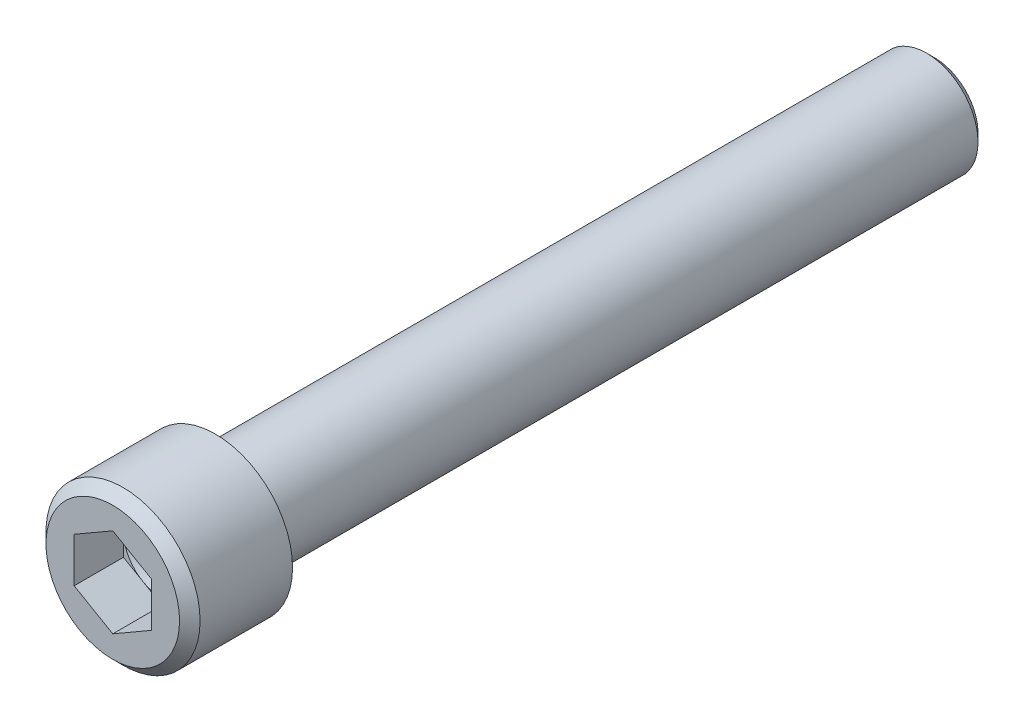
ISO-10303-21;
HEADER;
FILE_DESCRIPTION(('STEP AP214'),'2;1');
FILE_NAME('part.step','',(''),(''),'','','');
FILE_SCHEMA(('AUTOMOTIVE_DESIGN { 1 0 10303 214 1 1 1 1 }'));
ENDSEC;
DATA;
#1=APPLICATION_CONTEXT('core data for automotive mechanical design processes');
#2=APPLICATION_PROTOCOL_DEFINITION('international standard','automotive_design',2000,#1);
#3=PRODUCT_CONTEXT('',#1,'mechanical');
#4=PRODUCT('Part','Part','',(#3));
#5=PRODUCT_RELATED_PRODUCT_CATEGORY('part','',(#4));
#6=PRODUCT_DEFINITION_FORMATION('','',#4);
#7=PRODUCT_DEFINITION_CONTEXT('part definition',#1,'design');
#8=PRODUCT_DEFINITION('design','',#6,#7);
#9=PRODUCT_DEFINITION_SHAPE('','',#8);
#10=(LENGTH_UNIT() NAMED_UNIT(*) SI_UNIT(.MILLI.,.METRE.));
#11=(NAMED_UNIT(*) PLANE_ANGLE_UNIT() SI_UNIT($,.RADIAN.));
#12=(NAMED_UNIT(*) SI_UNIT($,.STERADIAN.) SOLID_ANGLE_UNIT());
#13=UNCERTAINTY_MEASURE_WITH_UNIT(LENGTH_MEASURE(1.E-05),#10,'distance_accuracy_value','');
#14=(GEOMETRIC_REPRESENTATION_CONTEXT(3) GLOBAL_UNCERTAINTY_ASSIGNED_CONTEXT((#13)) GLOBAL_UNIT_ASSIGNED_CONTEXT((#10,
#11,#12)) REPRESENTATION_CONTEXT('',''));
#15=CARTESIAN_POINT('',(0.,0.,0.));
#16=DIRECTION('',(0.,0.,1.));
#17=DIRECTION('',(1.,0.,0.));
#18=AXIS2_PLACEMENT_3D('',#15,#16,#17);
#19=CARTESIAN_POINT('',(0.,0.,3.302));
#20=DIRECTION('',(0.,0.,1.));
#21=DIRECTION('',(1.,0.,0.));
#22=AXIS2_PLACEMENT_3D('',#19,#20,#21);
#23=PLANE('',#22);
#24=DIRECTION('',(0.,1.,0.));
#25=VECTOR('',#24,1.);
#26=CARTESIAN_POINT('',(-2.3876,0.,3.302));
#27=LINE('',#26,#25);
#28=CARTESIAN_POINT('',(-2.3876,0.,3.302));
#29=VERTEX_POINT('',#28);
#30=CARTESIAN_POINT('',(-2.3876,1.37848150271715,3.302));
#31=VERTEX_POINT('',#30);
#32=EDGE_CURVE('E396',#29,#31,#27,.T.);
#33=ORIENTED_EDGE('',*,*,#32,.F.);
#34=CARTESIAN_POINT('',(0.,0.,3.302));
#35=DIRECTION('',(0.,0.,-1.));
#36=DIRECTION('',(-1.,0.,0.));
#37=AXIS2_PLACEMENT_3D('',#34,#35,#36);
#38=CIRCLE('',#37,2.3876);
#39=CARTESIAN_POINT('',(-1.1938,2.06772225407573,3.302));
#40=VERTEX_POINT('',#39);
#41=EDGE_CURVE('E33',#29,#40,#38,.T.);
#42=ORIENTED_EDGE('',*,*,#41,.T.);
#43=DIRECTION('',(0.866025403784438,0.5,0.));
#44=VECTOR('',#43,1.);
#45=CARTESIAN_POINT('',(-1.1938,2.06772225407573,3.302));
#46=LINE('',#45,#44);
#47=EDGE_CURVE('E391',#31,#40,#46,.T.);
#48=ORIENTED_EDGE('',*,*,#47,.F.);
#49=EDGE_LOOP('',(#33,#42,#48));
#50=FACE_BOUND('',#49,.T.);
#51=ADVANCED_FACE('F17',(#50),#23,.T.);
#52=CARTESIAN_POINT('',(0.,2.7569630054343,3.302));
#53=VERTEX_POINT('',#52);
#54=EDGE_CURVE('E389',#40,#53,#46,.T.);
#55=ORIENTED_EDGE('',*,*,#54,.F.);
#56=CARTESIAN_POINT('',(1.1938,2.06772225407573,3.302));
#57=VERTEX_POINT('',#56);
#58=EDGE_CURVE('E223',#40,#57,#38,.T.);
#59=ORIENTED_EDGE('',*,*,#58,.T.);
#60=DIRECTION('',(0.866025403784439,-0.5,0.));
#61=VECTOR('',#60,1.);
#62=CARTESIAN_POINT('',(1.1938,2.06772225407573,3.302));
#63=LINE('',#62,#61);
#64=EDGE_CURVE('E381',#53,#57,#63,.T.);
#65=ORIENTED_EDGE('',*,*,#64,.F.);
#66=EDGE_LOOP('',(#55,#59,#65));
#67=FACE_BOUND('',#66,.T.);
#68=ADVANCED_FACE('F105',(#67),#23,.T.);
#69=CARTESIAN_POINT('',(2.3876,1.37848150271715,3.302));
#70=VERTEX_POINT('',#69);
#71=EDGE_CURVE('E189',#57,#70,#63,.T.);
#72=ORIENTED_EDGE('',*,*,#71,.F.);
#73=CARTESIAN_POINT('',(2.3876,0.,3.302));
#74=VERTEX_POINT('',#73);
#75=EDGE_CURVE('E378',#57,#74,#38,.T.);
#76=ORIENTED_EDGE('',*,*,#75,.T.);
#77=DIRECTION('',(0.,-1.,0.));
#78=VECTOR('',#77,1.);
#79=CARTESIAN_POINT('',(2.3876,0.,3.302));
#80=LINE('',#79,#78);
#81=EDGE_CURVE('E160',#70,#74,#80,.T.);
#82=ORIENTED_EDGE('',*,*,#81,.F.);
#83=EDGE_LOOP('',(#72,#76,#82));
#84=FACE_BOUND('',#83,.T.);
#85=ADVANCED_FACE('F111',(#84),#23,.T.);
#86=CARTESIAN_POINT('',(2.3876,-1.37848150271715,3.302));
#87=VERTEX_POINT('',#86);
#88=EDGE_CURVE('E155',#74,#87,#80,.T.);
#89=ORIENTED_EDGE('',*,*,#88,.F.);
#90=CARTESIAN_POINT('',(1.1938,-2.06772225407573,3.302));
#91=VERTEX_POINT('',#90);
#92=EDGE_CURVE('E416',#74,#91,#38,.T.);
#93=ORIENTED_EDGE('',*,*,#92,.T.);
#94=DIRECTION('',(-0.866025403784439,-0.5,0.));
#95=VECTOR('',#94,1.);
#96=CARTESIAN_POINT('',(1.1938,-2.06772225407573,3.302));
#97=LINE('',#96,#95);
#98=EDGE_CURVE('E148',#87,#91,#97,.T.);
#99=ORIENTED_EDGE('',*,*,#98,.F.);
#100=EDGE_LOOP('',(#89,#93,#99));
#101=FACE_BOUND('',#100,.T.);
#102=ADVANCED_FACE('F129',(#101),#23,.T.);
#103=CARTESIAN_POINT('',(0.,-2.7569630054343,3.302));
#104=VERTEX_POINT('',#103);
#105=EDGE_CURVE('E141',#91,#104,#97,.T.);
#106=ORIENTED_EDGE('',*,*,#105,.F.);
#107=CARTESIAN_POINT('',(-1.1938,-2.06772225407573,3.302));
#108=VERTEX_POINT('',#107);
#109=EDGE_CURVE('E143',#91,#108,#38,.T.);
#110=ORIENTED_EDGE('',*,*,#109,.T.);
#111=DIRECTION('',(-0.866025403784439,0.5,0.));
#112=VECTOR('',#111,1.);
#113=CARTESIAN_POINT('',(-1.1938,-2.06772225407573,3.302));
#114=LINE('',#113,#112);
#115=EDGE_CURVE('E145',#104,#108,#114,.T.);
#116=ORIENTED_EDGE('',*,*,#115,.F.);
#117=EDGE_LOOP('',(#106,#110,#116));
#118=FACE_BOUND('',#117,.T.);
#119=ADVANCED_FACE('F119',(#118),#23,.T.);
#120=CARTESIAN_POINT('',(0.,0.,6.35));
#121=DIRECTION('',(0.,0.,1.));
#122=DIRECTION('',(1.,0.,0.));
#123=AXIS2_PLACEMENT_3D('',#120,#121,#122);
#124=PLANE('',#123);
#125=CARTESIAN_POINT('',(0.,0.,6.35));
#126=DIRECTION('',(0.,0.,1.));
#127=DIRECTION('',(1.,0.,0.));
#128=AXIS2_PLACEMENT_3D('',#125,#126,#127);
#129=CIRCLE('',#128,4.1275);
#130=CARTESIAN_POINT('',(4.1275,0.,6.35));
#131=VERTEX_POINT('',#130);
#132=EDGE_CURVE('E209',#131,#131,#129,.T.);
#133=ORIENTED_EDGE('',*,*,#132,.T.);
#134=EDGE_LOOP('',(#133));
#135=FACE_BOUND('',#134,.T.);
#136=DIRECTION('',(0.866025403784438,0.5,0.));
#137=VECTOR('',#136,1.);
#138=CARTESIAN_POINT('',(-1.1938,2.06772225407573,6.35));
#139=LINE('',#138,#137);
#140=CARTESIAN_POINT('',(-2.3876,1.37848150271715,6.35));
#141=VERTEX_POINT('',#140);
#142=CARTESIAN_POINT('',(0.,2.7569630054343,6.35));
#143=VERTEX_POINT('',#142);
#144=EDGE_CURVE('E172',#141,#143,#139,.T.);
#145=ORIENTED_EDGE('',*,*,#144,.T.);
#146=DIRECTION('',(0.866025403784439,-0.5,0.));
#147=VECTOR('',#146,1.);
#148=CARTESIAN_POINT('',(1.1938,2.06772225407573,6.35));
#149=LINE('',#148,#147);
#150=CARTESIAN_POINT('',(2.3876,1.37848150271715,6.35));
#151=VERTEX_POINT('',#150);
#152=EDGE_CURVE('E168',#143,#151,#149,.T.);
#153=ORIENTED_EDGE('',*,*,#152,.T.);
#154=DIRECTION('',(0.,-1.,0.));
#155=VECTOR('',#154,1.);
#156=CARTESIAN_POINT('',(2.3876,0.,6.35));
#157=LINE('',#156,#155);
#158=CARTESIAN_POINT('',(2.3876,-1.37848150271715,6.35));
#159=VERTEX_POINT('',#158);
#160=EDGE_CURVE('E185',#151,#159,#157,.T.);
#161=ORIENTED_EDGE('',*,*,#160,.T.);
#162=DIRECTION('',(-0.866025403784439,-0.5,0.));
#163=VECTOR('',#162,1.);
#164=CARTESIAN_POINT('',(1.1938,-2.06772225407573,6.35));
#165=LINE('',#164,#163);
#166=CARTESIAN_POINT('',(0.,-2.7569630054343,6.35));
#167=VERTEX_POINT('',#166);
#168=EDGE_CURVE('E41',#159,#167,#165,.T.);
#169=ORIENTED_EDGE('',*,*,#168,.T.);
#170=DIRECTION('',(-0.866025403784439,0.5,0.));
#171=VECTOR('',#170,1.);
#172=CARTESIAN_POINT('',(-1.1938,-2.06772225407573,6.35));
#173=LINE('',#172,#171);
#174=CARTESIAN_POINT('',(-2.3876,-1.37848150271715,6.35));
#175=VERTEX_POINT('',#174);
#176=EDGE_CURVE('E180',#167,#175,#173,.T.);
#177=ORIENTED_EDGE('',*,*,#176,.T.);
#178=DIRECTION('',(0.,1.,0.));
#179=VECTOR('',#178,1.);
#180=CARTESIAN_POINT('',(-2.3876,0.,6.35));
#181=LINE('',#180,#179);
#182=EDGE_CURVE('E176',#175,#141,#181,.T.);
#183=ORIENTED_EDGE('',*,*,#182,.T.);
#184=EDGE_LOOP('',(#145,#153,#161,#169,#177,#183));
#185=FACE_BOUND('',#184,.T.);
#186=ADVANCED_FACE('F128',(#135,#185),#124,.T.);
#187=CARTESIAN_POINT('',(0.,0.,6.35));
#188=DIRECTION('',(0.,0.,-1.));
#189=DIRECTION('',(-1.,0.,0.));
#190=AXIS2_PLACEMENT_3D('',#187,#188,#189);
#191=CYLINDRICAL_SURFACE('',#190,4.7625);
#192=CARTESIAN_POINT('',(0.,0.,5.715));
#193=DIRECTION('',(0.,0.,1.));
#194=DIRECTION('',(1.,0.,0.));
#195=AXIS2_PLACEMENT_3D('',#192,#193,#194);
#196=CIRCLE('',#195,4.7625);
#197=CARTESIAN_POINT('',(4.7625,0.,5.715));
#198=VERTEX_POINT('',#197);
#199=EDGE_CURVE('E213',#198,#198,#196,.F.);
#200=ORIENTED_EDGE('',*,*,#199,.T.);
#201=EDGE_LOOP('',(#200));
#202=FACE_BOUND('',#201,.T.);
#203=CARTESIAN_POINT('',(0.,0.,0.));
#204=DIRECTION('',(0.,0.,1.));
#205=DIRECTION('',(1.,0.,0.));
#206=AXIS2_PLACEMENT_3D('',#203,#204,#205);
#207=CIRCLE('',#206,4.7625);
#208=CARTESIAN_POINT('',(4.7625,0.,0.));
#209=VERTEX_POINT('',#208);
#210=EDGE_CURVE('E205',#209,#209,#207,.T.);
#211=ORIENTED_EDGE('',*,*,#210,.T.);
#212=EDGE_LOOP('',(#211));
#213=FACE_BOUND('',#212,.T.);
#214=ADVANCED_FACE('F134',(#202,#213),#191,.T.);
#215=CARTESIAN_POINT('',(0.,0.,0.));
#216=DIRECTION('',(0.,0.,1.));
#217=DIRECTION('',(1.,0.,0.));
#218=AXIS2_PLACEMENT_3D('',#215,#216,#217);
#219=PLANE('',#218);
#220=CARTESIAN_POINT('',(0.,0.,0.));
#221=DIRECTION('',(0.,0.,1.));
#222=DIRECTION('',(1.,0.,0.));
#223=AXIS2_PLACEMENT_3D('',#220,#221,#222);
#224=CIRCLE('',#223,3.3528);
#225=CARTESIAN_POINT('',(3.3528,0.,0.));
#226=VERTEX_POINT('',#225);
#227=EDGE_CURVE('E222',#226,#226,#224,.T.);
#228=ORIENTED_EDGE('',*,*,#227,.T.);
#229=EDGE_LOOP('',(#228));
#230=FACE_BOUND('',#229,.T.);
#231=ORIENTED_EDGE('',*,*,#210,.F.);
#232=EDGE_LOOP('',(#231));
#233=FACE_BOUND('',#232,.T.);
#234=ADVANCED_FACE('F322',(#230,#233),#219,.F.);
#235=CARTESIAN_POINT('',(0.,0.,6.35));
#236=DIRECTION('',(0.,0.,-1.));
#237=DIRECTION('',(-1.,0.,0.));
#238=AXIS2_PLACEMENT_3D('',#235,#236,#237);
#239=CONICAL_SURFACE('',#238,4.1275,0.785398163397448);
#240=ORIENTED_EDGE('',*,*,#199,.F.);
#241=EDGE_LOOP('',(#240));
#242=FACE_BOUND('',#241,.T.);
#243=ORIENTED_EDGE('',*,*,#132,.F.);
#244=EDGE_LOOP('',(#243));
#245=FACE_BOUND('',#244,.T.);
#246=ADVANCED_FACE('F313',(#242,#245),#239,.T.);
#247=CARTESIAN_POINT('',(1.1938,2.06772225407573,3.302));
#248=DIRECTION('',(-0.5,-0.866025403784439,0.));
#249=DIRECTION('',(0.866025403784439,-0.5,0.));
#250=AXIS2_PLACEMENT_3D('',#247,#248,#249);
#251=PLANE('',#250);
#252=ORIENTED_EDGE('',*,*,#152,.F.);
#253=DIRECTION('',(0.,0.,1.));
#254=VECTOR('',#253,1.);
#255=CARTESIAN_POINT('',(0.,2.7569630054343,3.302));
#256=LINE('',#255,#254);
#257=EDGE_CURVE('E202',#53,#143,#256,.T.);
#258=ORIENTED_EDGE('',*,*,#257,.F.);
#259=ORIENTED_EDGE('',*,*,#64,.T.);
#260=ORIENTED_EDGE('',*,*,#71,.T.);
#261=DIRECTION('',(0.,0.,1.));
#262=VECTOR('',#261,1.);
#263=CARTESIAN_POINT('',(2.3876,1.37848150271715,3.302));
#264=LINE('',#263,#262);
#265=EDGE_CURVE('E167',#70,#151,#264,.T.);
#266=ORIENTED_EDGE('',*,*,#265,.T.);
#267=EDGE_LOOP('',(#252,#258,#259,#260,#266));
#268=FACE_BOUND('',#267,.T.);
#269=ADVANCED_FACE('F304',(#268),#251,.T.);
#270=CARTESIAN_POINT('',(-1.1938,2.06772225407573,3.302));
#271=DIRECTION('',(0.5,-0.866025403784438,0.));
#272=DIRECTION('',(0.866025403784438,0.5,0.));
#273=AXIS2_PLACEMENT_3D('',#270,#271,#272);
#274=PLANE('',#273);
#275=ORIENTED_EDGE('',*,*,#144,.F.);
#276=DIRECTION('',(0.,0.,1.));
#277=VECTOR('',#276,1.);
#278=CARTESIAN_POINT('',(-2.3876,1.37848150271715,3.302));
#279=LINE('',#278,#277);
#280=EDGE_CURVE('E200',#31,#141,#279,.T.);
#281=ORIENTED_EDGE('',*,*,#280,.F.);
#282=ORIENTED_EDGE('',*,*,#47,.T.);
#283=ORIENTED_EDGE('',*,*,#54,.T.);
#284=ORIENTED_EDGE('',*,*,#257,.T.);
#285=EDGE_LOOP('',(#275,#281,#282,#283,#284));
#286=FACE_BOUND('',#285,.T.);
#287=ADVANCED_FACE('F295',(#286),#274,.T.);
#288=CARTESIAN_POINT('',(-2.3876,0.,3.302));
#289=DIRECTION('',(1.,0.,0.));
#290=DIRECTION('',(0.,1.,0.));
#291=AXIS2_PLACEMENT_3D('',#288,#289,#290);
#292=PLANE('',#291);
#293=ORIENTED_EDGE('',*,*,#182,.F.);
#294=DIRECTION('',(0.,0.,1.));
#295=VECTOR('',#294,1.);
#296=CARTESIAN_POINT('',(-2.3876,-1.37848150271715,3.302));
#297=LINE('',#296,#295);
#298=CARTESIAN_POINT('',(-2.3876,-1.37848150271715,3.302));
#299=VERTEX_POINT('',#298);
#300=EDGE_CURVE('E197',#299,#175,#297,.T.);
#301=ORIENTED_EDGE('',*,*,#300,.F.);
#302=EDGE_CURVE('E397',#299,#29,#27,.T.);
#303=ORIENTED_EDGE('',*,*,#302,.T.);
#304=ORIENTED_EDGE('',*,*,#32,.T.);
#305=ORIENTED_EDGE('',*,*,#280,.T.);
#306=EDGE_LOOP('',(#293,#301,#303,#304,#305));
#307=FACE_BOUND('',#306,.T.);
#308=ADVANCED_FACE('F286',(#307),#292,.T.);
#309=CARTESIAN_POINT('',(-1.1938,-2.06772225407573,3.302));
#310=DIRECTION('',(0.5,0.866025403784439,0.));
#311=DIRECTION('',(-0.866025403784439,0.5,0.));
#312=AXIS2_PLACEMENT_3D('',#309,#310,#311);
#313=PLANE('',#312);
#314=ORIENTED_EDGE('',*,*,#176,.F.);
#315=DIRECTION('',(0.,0.,1.));
#316=VECTOR('',#315,1.);
#317=CARTESIAN_POINT('',(0.,-2.7569630054343,3.302));
#318=LINE('',#317,#316);
#319=EDGE_CURVE('E194',#104,#167,#318,.T.);
#320=ORIENTED_EDGE('',*,*,#319,.F.);
#321=ORIENTED_EDGE('',*,*,#115,.T.);
#322=EDGE_CURVE('E400',#108,#299,#114,.T.);
#323=ORIENTED_EDGE('',*,*,#322,.T.);
#324=ORIENTED_EDGE('',*,*,#300,.T.);
#325=EDGE_LOOP('',(#314,#320,#321,#323,#324));
#326=FACE_BOUND('',#325,.T.);
#327=ADVANCED_FACE('F278',(#326),#313,.T.);
#328=CARTESIAN_POINT('',(1.1938,-2.06772225407573,3.302));
#329=DIRECTION('',(-0.5,0.866025403784439,0.));
#330=DIRECTION('',(-0.866025403784439,-0.5,0.));
#331=AXIS2_PLACEMENT_3D('',#328,#329,#330);
#332=PLANE('',#331);
#333=ORIENTED_EDGE('',*,*,#168,.F.);
#334=DIRECTION('',(0.,0.,1.));
#335=VECTOR('',#334,1.);
#336=CARTESIAN_POINT('',(2.3876,-1.37848150271715,3.302));
#337=LINE('',#336,#335);
#338=EDGE_CURVE('E151',#87,#159,#337,.T.);
#339=ORIENTED_EDGE('',*,*,#338,.F.);
#340=ORIENTED_EDGE('',*,*,#98,.T.);
#341=ORIENTED_EDGE('',*,*,#105,.T.);
#342=ORIENTED_EDGE('',*,*,#319,.T.);
#343=EDGE_LOOP('',(#333,#339,#340,#341,#342));
#344=FACE_BOUND('',#343,.T.);
#345=ADVANCED_FACE('F124',(#344),#332,.T.);
#346=CARTESIAN_POINT('',(2.3876,0.,3.302));
#347=DIRECTION('',(-1.,0.,0.));
#348=DIRECTION('',(0.,0.,1.));
#349=AXIS2_PLACEMENT_3D('',#346,#347,#348);
#350=PLANE('',#349);
#351=ORIENTED_EDGE('',*,*,#160,.F.);
#352=ORIENTED_EDGE('',*,*,#265,.F.);
#353=ORIENTED_EDGE('',*,*,#81,.T.);
#354=ORIENTED_EDGE('',*,*,#88,.T.);
#355=ORIENTED_EDGE('',*,*,#338,.T.);
#356=EDGE_LOOP('',(#351,#352,#353,#354,#355));
#357=FACE_BOUND('',#356,.T.);
#358=ADVANCED_FACE('F117',(#357),#350,.T.);
#359=ORIENTED_EDGE('',*,*,#322,.F.);
#360=EDGE_CURVE('E217',#108,#29,#38,.T.);
#361=ORIENTED_EDGE('',*,*,#360,.T.);
#362=ORIENTED_EDGE('',*,*,#302,.F.);
#363=EDGE_LOOP('',(#359,#361,#362));
#364=FACE_BOUND('',#363,.T.);
#365=ADVANCED_FACE('F108',(#364),#23,.T.);
#366=CARTESIAN_POINT('',(0.,0.,-44.45));
#367=DIRECTION('',(0.,0.,1.));
#368=DIRECTION('',(1.,0.,0.));
#369=AXIS2_PLACEMENT_3D('',#366,#367,#368);
#370=CYLINDRICAL_SURFACE('',#369,3.175);
#371=CARTESIAN_POINT('',(0.,0.,-43.9591909298675));
#372=DIRECTION('',(0.,0.,-1.));
#373=DIRECTION('',(-1.,0.,0.));
#374=AXIS2_PLACEMENT_3D('',#371,#372,#373);
#375=CIRCLE('',#374,3.175);
#376=CARTESIAN_POINT('',(-3.175,0.,-43.9591909298675));
#377=VERTEX_POINT('',#376);
#378=EDGE_CURVE('E11',#377,#377,#375,.F.);
#379=ORIENTED_EDGE('',*,*,#378,.T.);
#380=EDGE_LOOP('',(#379));
#381=FACE_BOUND('',#380,.T.);
#382=CARTESIAN_POINT('',(0.,0.,-0.1778));
#383=DIRECTION('',(0.,0.,1.));
#384=DIRECTION('',(1.,0.,0.));
#385=AXIS2_PLACEMENT_3D('',#382,#383,#384);
#386=CIRCLE('',#385,3.175);
#387=CARTESIAN_POINT('',(3.175,0.,-0.1778));
#388=VERTEX_POINT('',#387);
#389=EDGE_CURVE('E218',#388,#388,#386,.F.);
#390=ORIENTED_EDGE('',*,*,#389,.T.);
#391=EDGE_LOOP('',(#390));
#392=FACE_BOUND('',#391,.T.);
#393=ADVANCED_FACE('F101',(#381,#392),#370,.T.);
#394=CARTESIAN_POINT('',(0.,0.,-44.45));
#395=DIRECTION('',(0.,0.,-1.));
#396=DIRECTION('',(1.,0.,0.));
#397=AXIS2_PLACEMENT_3D('',#394,#395,#396);
#398=PLANE('',#397);
#399=CARTESIAN_POINT('',(0.,0.,-44.45));
#400=DIRECTION('',(0.,0.,-1.));
#401=DIRECTION('',(-1.,0.,0.));
#402=AXIS2_PLACEMENT_3D('',#399,#400,#401);
#403=CIRCLE('',#402,2.6841909298675);
#404=CARTESIAN_POINT('',(-2.6841909298675,0.,-44.45));
#405=VERTEX_POINT('',#404);
#406=EDGE_CURVE('E26',#405,#405,#403,.T.);
#407=ORIENTED_EDGE('',*,*,#406,.T.);
#408=EDGE_LOOP('',(#407));
#409=FACE_BOUND('',#408,.T.);
#410=ADVANCED_FACE('F94',(#409),#398,.T.);
#411=CARTESIAN_POINT('',(0.,0.,1.92351849728284));
#412=DIRECTION('',(0.,0.,1.));
#413=DIRECTION('',(1.,0.,0.));
#414=AXIS2_PLACEMENT_3D('',#411,#412,#413);
#415=CONICAL_SURFACE('',#414,0.,1.0471975511966);
#416=ORIENTED_EDGE('',*,*,#41,.F.);
#417=ORIENTED_EDGE('',*,*,#360,.F.);
#418=ORIENTED_EDGE('',*,*,#109,.F.);
#419=ORIENTED_EDGE('',*,*,#92,.F.);
#420=ORIENTED_EDGE('',*,*,#75,.F.);
#421=ORIENTED_EDGE('',*,*,#58,.F.);
#422=EDGE_LOOP('',(#416,#417,#418,#419,#420,#421));
#423=FACE_BOUND('',#422,.T.);
#424=CARTESIAN_POINT('',(0.,0.,1.92351849728284));
#425=VERTEX_POINT('',#424);
#426=VERTEX_LOOP('',#425);
#427=FACE_BOUND('',#426,.T.);
#428=ADVANCED_FACE('F91',(#423,#427),#415,.F.);
#429=CARTESIAN_POINT('',(0.,0.,-0.1778));
#430=DIRECTION('',(0.,0.,1.));
#431=DIRECTION('',(1.,0.,0.));
#432=AXIS2_PLACEMENT_3D('',#429,#430,#431);
#433=TOROIDAL_SURFACE('',#432,3.3528,0.1778);
#434=ORIENTED_EDGE('',*,*,#227,.F.);
#435=EDGE_LOOP('',(#434));
#436=FACE_BOUND('',#435,.T.);
#437=ORIENTED_EDGE('',*,*,#389,.F.);
#438=EDGE_LOOP('',(#437));
#439=FACE_BOUND('',#438,.T.);
#440=ADVANCED_FACE('F93',(#436,#439),#433,.F.);
#441=CARTESIAN_POINT('',(0.,0.,-44.45));
#442=DIRECTION('',(0.,0.,1.));
#443=DIRECTION('',(1.,0.,0.));
#444=AXIS2_PLACEMENT_3D('',#441,#442,#443);
#445=CONICAL_SURFACE('',#444,2.6841909298675,0.78539816339745);
#446=ORIENTED_EDGE('',*,*,#378,.F.);
#447=EDGE_LOOP('',(#446));
#448=FACE_BOUND('',#447,.T.);
#449=ORIENTED_EDGE('',*,*,#406,.F.);
#450=EDGE_LOOP('',(#449));
#451=FACE_BOUND('',#450,.T.);
#452=ADVANCED_FACE('F19',(#448,#451),#445,.T.);
#453=CLOSED_SHELL('',(#51,#68,#85,#102,#119,#186,#214,#234,#246,#269,#287,#308,#327,#345,#358,
#365,#393,#410,#428,#440,#452));
#454=MANIFOLD_SOLID_BREP('B1',#453);
#455=ADVANCED_BREP_SHAPE_REPRESENTATION('',(#18,#454),#14);
#456=SHAPE_DEFINITION_REPRESENTATION(#9,#455);
ENDSEC;
END-ISO-10303-21;
